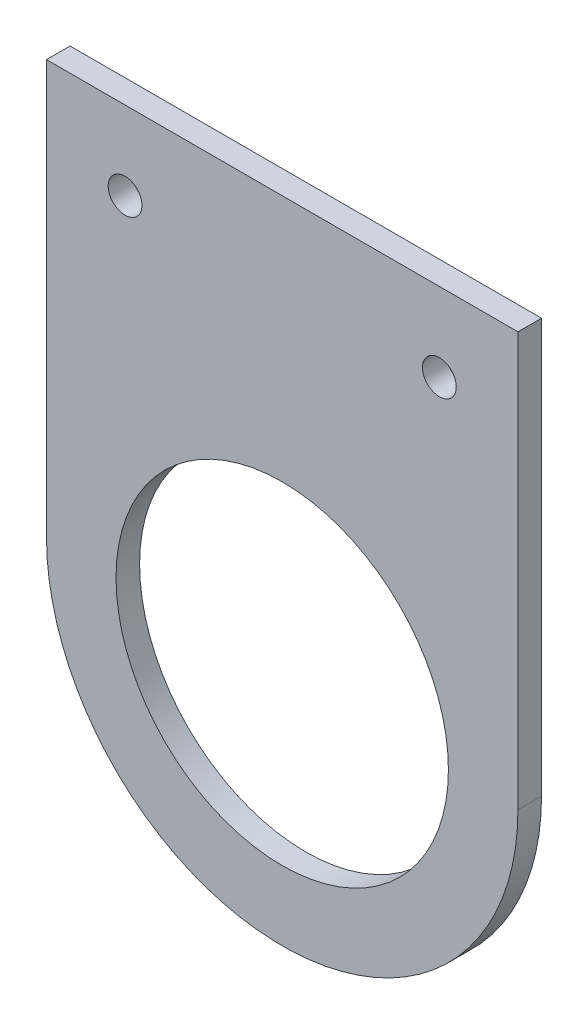
ISO-10303-21;
HEADER;
FILE_DESCRIPTION(('STEP AP214'),'2;1');
FILE_NAME('part.step','',(''),(''),'','','');
FILE_SCHEMA(('AUTOMOTIVE_DESIGN { 1 0 10303 214 1 1 1 1 }'));
ENDSEC;
DATA;
#1=APPLICATION_CONTEXT('core data for automotive mechanical design processes');
#2=APPLICATION_PROTOCOL_DEFINITION('international standard','automotive_design',2000,#1);
#3=PRODUCT_CONTEXT('',#1,'mechanical');
#4=PRODUCT('Part','Part','',(#3));
#5=PRODUCT_RELATED_PRODUCT_CATEGORY('part','',(#4));
#6=PRODUCT_DEFINITION_FORMATION('','',#4);
#7=PRODUCT_DEFINITION_CONTEXT('part definition',#1,'design');
#8=PRODUCT_DEFINITION('design','',#6,#7);
#9=PRODUCT_DEFINITION_SHAPE('','',#8);
#10=(LENGTH_UNIT() NAMED_UNIT(*) SI_UNIT(.MILLI.,.METRE.));
#11=(NAMED_UNIT(*) PLANE_ANGLE_UNIT() SI_UNIT($,.RADIAN.));
#12=(NAMED_UNIT(*) SI_UNIT($,.STERADIAN.) SOLID_ANGLE_UNIT());
#13=UNCERTAINTY_MEASURE_WITH_UNIT(LENGTH_MEASURE(1.E-05),#10,'distance_accuracy_value','');
#14=(GEOMETRIC_REPRESENTATION_CONTEXT(3) GLOBAL_UNCERTAINTY_ASSIGNED_CONTEXT((#13)) GLOBAL_UNIT_ASSIGNED_CONTEXT((#10,
#11,#12)) REPRESENTATION_CONTEXT('',''));
#15=CARTESIAN_POINT('',(0.,0.,0.));
#16=DIRECTION('',(0.,0.,1.));
#17=DIRECTION('',(1.,0.,0.));
#18=AXIS2_PLACEMENT_3D('',#15,#16,#17);
#19=CARTESIAN_POINT('',(0.,0.,3.));
#20=DIRECTION('',(0.,0.,-1.));
#21=DIRECTION('',(-1.,0.,0.));
#22=AXIS2_PLACEMENT_3D('',#19,#20,#21);
#23=PLANE('',#22);
#24=CARTESIAN_POINT('',(0.,0.,3.));
#25=DIRECTION('',(0.,0.,1.));
#26=DIRECTION('',(-1.,0.,0.));
#27=AXIS2_PLACEMENT_3D('',#24,#25,#26);
#28=CIRCLE('',#27,30.);
#29=CARTESIAN_POINT('',(-30.,0.,3.));
#30=VERTEX_POINT('',#29);
#31=CARTESIAN_POINT('',(30.,0.,3.));
#32=VERTEX_POINT('',#31);
#33=EDGE_CURVE('E87',#30,#32,#28,.T.);
#34=ORIENTED_EDGE('',*,*,#33,.T.);
#35=DIRECTION('',(0.,1.,0.));
#36=VECTOR('',#35,1.);
#37=CARTESIAN_POINT('',(30.,52.68,3.));
#38=LINE('',#37,#36);
#39=CARTESIAN_POINT('',(30.,52.68,3.));
#40=VERTEX_POINT('',#39);
#41=EDGE_CURVE('E82',#32,#40,#38,.T.);
#42=ORIENTED_EDGE('',*,*,#41,.T.);
#43=DIRECTION('',(-1.,0.,0.));
#44=VECTOR('',#43,1.);
#45=CARTESIAN_POINT('',(-30.,52.68,3.));
#46=LINE('',#45,#44);
#47=CARTESIAN_POINT('',(-30.,52.68,3.));
#48=VERTEX_POINT('',#47);
#49=EDGE_CURVE('E85',#40,#48,#46,.T.);
#50=ORIENTED_EDGE('',*,*,#49,.T.);
#51=DIRECTION('',(0.,-1.,0.));
#52=VECTOR('',#51,1.);
#53=CARTESIAN_POINT('',(-30.,0.,3.));
#54=LINE('',#53,#52);
#55=EDGE_CURVE('E52',#48,#30,#54,.T.);
#56=ORIENTED_EDGE('',*,*,#55,.T.);
#57=EDGE_LOOP('',(#34,#42,#50,#56));
#58=FACE_BOUND('',#57,.T.);
#59=CARTESIAN_POINT('',(0.,0.,3.));
#60=DIRECTION('',(0.,0.,1.));
#61=DIRECTION('',(1.,0.,0.));
#62=AXIS2_PLACEMENT_3D('',#59,#60,#61);
#63=CIRCLE('',#62,21.15);
#64=CARTESIAN_POINT('',(21.15,0.,3.));
#65=VERTEX_POINT('',#64);
#66=EDGE_CURVE('E102',#65,#65,#63,.T.);
#67=ORIENTED_EDGE('',*,*,#66,.F.);
#68=EDGE_LOOP('',(#67));
#69=FACE_BOUND('',#68,.T.);
#70=CARTESIAN_POINT('',(-20.,42.68,3.));
#71=DIRECTION('',(0.,0.,1.));
#72=DIRECTION('',(1.,0.,0.));
#73=AXIS2_PLACEMENT_3D('',#70,#71,#72);
#74=CIRCLE('',#73,2.15);
#75=CARTESIAN_POINT('',(-17.85,42.68,3.));
#76=VERTEX_POINT('',#75);
#77=EDGE_CURVE('E117',#76,#76,#74,.T.);
#78=ORIENTED_EDGE('',*,*,#77,.F.);
#79=EDGE_LOOP('',(#78));
#80=FACE_BOUND('',#79,.T.);
#81=CARTESIAN_POINT('',(20.,42.68,3.));
#82=DIRECTION('',(0.,0.,1.));
#83=DIRECTION('',(1.,0.,0.));
#84=AXIS2_PLACEMENT_3D('',#81,#82,#83);
#85=CIRCLE('',#84,2.15);
#86=CARTESIAN_POINT('',(22.15,42.68,3.));
#87=VERTEX_POINT('',#86);
#88=EDGE_CURVE('E123',#87,#87,#85,.T.);
#89=ORIENTED_EDGE('',*,*,#88,.F.);
#90=EDGE_LOOP('',(#89));
#91=FACE_BOUND('',#90,.T.);
#92=ADVANCED_FACE('F35',(#58,#69,#80,#91),#23,.F.);
#93=CARTESIAN_POINT('',(0.,0.,0.));
#94=DIRECTION('',(0.,0.,-1.));
#95=DIRECTION('',(-1.,0.,0.));
#96=AXIS2_PLACEMENT_3D('',#93,#94,#95);
#97=PLANE('',#96);
#98=CARTESIAN_POINT('',(-20.,42.68,0.));
#99=DIRECTION('',(0.,0.,1.));
#100=DIRECTION('',(1.,0.,0.));
#101=AXIS2_PLACEMENT_3D('',#98,#99,#100);
#102=CIRCLE('',#101,2.15);
#103=CARTESIAN_POINT('',(-17.85,42.68,0.));
#104=VERTEX_POINT('',#103);
#105=EDGE_CURVE('E120',#104,#104,#102,.T.);
#106=ORIENTED_EDGE('',*,*,#105,.T.);
#107=EDGE_LOOP('',(#106));
#108=FACE_BOUND('',#107,.T.);
#109=CARTESIAN_POINT('',(0.,0.,0.));
#110=DIRECTION('',(0.,0.,1.));
#111=DIRECTION('',(-1.,0.,0.));
#112=AXIS2_PLACEMENT_3D('',#109,#110,#111);
#113=CIRCLE('',#112,30.);
#114=CARTESIAN_POINT('',(-30.,0.,0.));
#115=VERTEX_POINT('',#114);
#116=CARTESIAN_POINT('',(30.,0.,0.));
#117=VERTEX_POINT('',#116);
#118=EDGE_CURVE('E99',#115,#117,#113,.T.);
#119=ORIENTED_EDGE('',*,*,#118,.F.);
#120=DIRECTION('',(0.,-1.,0.));
#121=VECTOR('',#120,1.);
#122=CARTESIAN_POINT('',(-30.,0.,0.));
#123=LINE('',#122,#121);
#124=CARTESIAN_POINT('',(-30.,52.68,0.));
#125=VERTEX_POINT('',#124);
#126=EDGE_CURVE('E75',#125,#115,#123,.T.);
#127=ORIENTED_EDGE('',*,*,#126,.F.);
#128=DIRECTION('',(-1.,0.,0.));
#129=VECTOR('',#128,1.);
#130=CARTESIAN_POINT('',(-30.,52.68,0.));
#131=LINE('',#130,#129);
#132=CARTESIAN_POINT('',(30.,52.68,0.));
#133=VERTEX_POINT('',#132);
#134=EDGE_CURVE('E69',#133,#125,#131,.T.);
#135=ORIENTED_EDGE('',*,*,#134,.F.);
#136=DIRECTION('',(0.,1.,0.));
#137=VECTOR('',#136,1.);
#138=CARTESIAN_POINT('',(30.,52.68,0.));
#139=LINE('',#138,#137);
#140=EDGE_CURVE('E91',#117,#133,#139,.T.);
#141=ORIENTED_EDGE('',*,*,#140,.F.);
#142=EDGE_LOOP('',(#119,#127,#135,#141));
#143=FACE_BOUND('',#142,.T.);
#144=CARTESIAN_POINT('',(0.,0.,0.));
#145=DIRECTION('',(0.,0.,1.));
#146=DIRECTION('',(1.,0.,0.));
#147=AXIS2_PLACEMENT_3D('',#144,#145,#146);
#148=CIRCLE('',#147,21.15);
#149=CARTESIAN_POINT('',(21.15,0.,0.));
#150=VERTEX_POINT('',#149);
#151=EDGE_CURVE('E114',#150,#150,#148,.T.);
#152=ORIENTED_EDGE('',*,*,#151,.T.);
#153=EDGE_LOOP('',(#152));
#154=FACE_BOUND('',#153,.T.);
#155=CARTESIAN_POINT('',(20.,42.68,0.));
#156=DIRECTION('',(0.,0.,1.));
#157=DIRECTION('',(1.,0.,0.));
#158=AXIS2_PLACEMENT_3D('',#155,#156,#157);
#159=CIRCLE('',#158,2.15);
#160=CARTESIAN_POINT('',(22.15,42.68,0.));
#161=VERTEX_POINT('',#160);
#162=EDGE_CURVE('E126',#161,#161,#159,.T.);
#163=ORIENTED_EDGE('',*,*,#162,.T.);
#164=EDGE_LOOP('',(#163));
#165=FACE_BOUND('',#164,.T.);
#166=ADVANCED_FACE('F110',(#108,#143,#154,#165),#97,.T.);
#167=CARTESIAN_POINT('',(0.,0.,3.));
#168=DIRECTION('',(0.,0.,-1.));
#169=DIRECTION('',(-1.,0.,0.));
#170=AXIS2_PLACEMENT_3D('',#167,#168,#169);
#171=CYLINDRICAL_SURFACE('',#170,30.);
#172=ORIENTED_EDGE('',*,*,#118,.T.);
#173=DIRECTION('',(0.,0.,-1.));
#174=VECTOR('',#173,1.);
#175=CARTESIAN_POINT('',(30.,0.,3.));
#176=LINE('',#175,#174);
#177=EDGE_CURVE('E11',#32,#117,#176,.T.);
#178=ORIENTED_EDGE('',*,*,#177,.F.);
#179=ORIENTED_EDGE('',*,*,#33,.F.);
#180=DIRECTION('',(0.,0.,-1.));
#181=VECTOR('',#180,1.);
#182=CARTESIAN_POINT('',(-30.,0.,3.));
#183=LINE('',#182,#181);
#184=EDGE_CURVE('E95',#30,#115,#183,.T.);
#185=ORIENTED_EDGE('',*,*,#184,.T.);
#186=EDGE_LOOP('',(#172,#178,#179,#185));
#187=FACE_BOUND('',#186,.T.);
#188=ADVANCED_FACE('F37',(#187),#171,.T.);
#189=CARTESIAN_POINT('',(30.,52.68,3.));
#190=DIRECTION('',(-1.,0.,0.));
#191=DIRECTION('',(0.,-1.,0.));
#192=AXIS2_PLACEMENT_3D('',#189,#190,#191);
#193=PLANE('',#192);
#194=ORIENTED_EDGE('',*,*,#140,.T.);
#195=DIRECTION('',(0.,0.,-1.));
#196=VECTOR('',#195,1.);
#197=CARTESIAN_POINT('',(30.,52.68,3.));
#198=LINE('',#197,#196);
#199=EDGE_CURVE('E44',#40,#133,#198,.T.);
#200=ORIENTED_EDGE('',*,*,#199,.F.);
#201=ORIENTED_EDGE('',*,*,#41,.F.);
#202=ORIENTED_EDGE('',*,*,#177,.T.);
#203=EDGE_LOOP('',(#194,#200,#201,#202));
#204=FACE_BOUND('',#203,.T.);
#205=ADVANCED_FACE('F90',(#204),#193,.F.);
#206=CARTESIAN_POINT('',(-30.,52.68,3.));
#207=DIRECTION('',(0.,-1.,0.));
#208=DIRECTION('',(0.,0.,-1.));
#209=AXIS2_PLACEMENT_3D('',#206,#207,#208);
#210=PLANE('',#209);
#211=ORIENTED_EDGE('',*,*,#134,.T.);
#212=DIRECTION('',(0.,0.,-1.));
#213=VECTOR('',#212,1.);
#214=CARTESIAN_POINT('',(-30.,52.68,3.));
#215=LINE('',#214,#213);
#216=EDGE_CURVE('E92',#48,#125,#215,.T.);
#217=ORIENTED_EDGE('',*,*,#216,.F.);
#218=ORIENTED_EDGE('',*,*,#49,.F.);
#219=ORIENTED_EDGE('',*,*,#199,.T.);
#220=EDGE_LOOP('',(#211,#217,#218,#219));
#221=FACE_BOUND('',#220,.T.);
#222=ADVANCED_FACE('F93',(#221),#210,.F.);
#223=CARTESIAN_POINT('',(-30.,0.,3.));
#224=DIRECTION('',(1.,0.,0.));
#225=DIRECTION('',(0.,1.,0.));
#226=AXIS2_PLACEMENT_3D('',#223,#224,#225);
#227=PLANE('',#226);
#228=ORIENTED_EDGE('',*,*,#126,.T.);
#229=ORIENTED_EDGE('',*,*,#184,.F.);
#230=ORIENTED_EDGE('',*,*,#55,.F.);
#231=ORIENTED_EDGE('',*,*,#216,.T.);
#232=EDGE_LOOP('',(#228,#229,#230,#231));
#233=FACE_BOUND('',#232,.T.);
#234=ADVANCED_FACE('F107',(#233),#227,.F.);
#235=CARTESIAN_POINT('',(0.,0.,3.));
#236=DIRECTION('',(0.,0.,-1.));
#237=DIRECTION('',(-1.,0.,0.));
#238=AXIS2_PLACEMENT_3D('',#235,#236,#237);
#239=CYLINDRICAL_SURFACE('',#238,21.15);
#240=ORIENTED_EDGE('',*,*,#66,.T.);
#241=EDGE_LOOP('',(#240));
#242=FACE_BOUND('',#241,.T.);
#243=ORIENTED_EDGE('',*,*,#151,.F.);
#244=EDGE_LOOP('',(#243));
#245=FACE_BOUND('',#244,.T.);
#246=ADVANCED_FACE('F143',(#242,#245),#239,.F.);
#247=CARTESIAN_POINT('',(-20.,42.68,3.));
#248=DIRECTION('',(0.,0.,-1.));
#249=DIRECTION('',(-1.,0.,0.));
#250=AXIS2_PLACEMENT_3D('',#247,#248,#249);
#251=CYLINDRICAL_SURFACE('',#250,2.15);
#252=ORIENTED_EDGE('',*,*,#77,.T.);
#253=EDGE_LOOP('',(#252));
#254=FACE_BOUND('',#253,.T.);
#255=ORIENTED_EDGE('',*,*,#105,.F.);
#256=EDGE_LOOP('',(#255));
#257=FACE_BOUND('',#256,.T.);
#258=ADVANCED_FACE('F189',(#254,#257),#251,.F.);
#259=CARTESIAN_POINT('',(20.,42.68,3.));
#260=DIRECTION('',(0.,0.,-1.));
#261=DIRECTION('',(-1.,0.,0.));
#262=AXIS2_PLACEMENT_3D('',#259,#260,#261);
#263=CYLINDRICAL_SURFACE('',#262,2.15);
#264=ORIENTED_EDGE('',*,*,#88,.T.);
#265=EDGE_LOOP('',(#264));
#266=FACE_BOUND('',#265,.T.);
#267=ORIENTED_EDGE('',*,*,#162,.F.);
#268=EDGE_LOOP('',(#267));
#269=FACE_BOUND('',#268,.T.);
#270=ADVANCED_FACE('F132',(#266,#269),#263,.F.);
#271=CLOSED_SHELL('',(#92,#166,#188,#205,#222,#234,#246,#258,#270));
#272=MANIFOLD_SOLID_BREP('B2',#271);
#273=ADVANCED_BREP_SHAPE_REPRESENTATION('',(#18,#272),#14);
#274=SHAPE_DEFINITION_REPRESENTATION(#9,#273);
ENDSEC;
END-ISO-10303-21;
